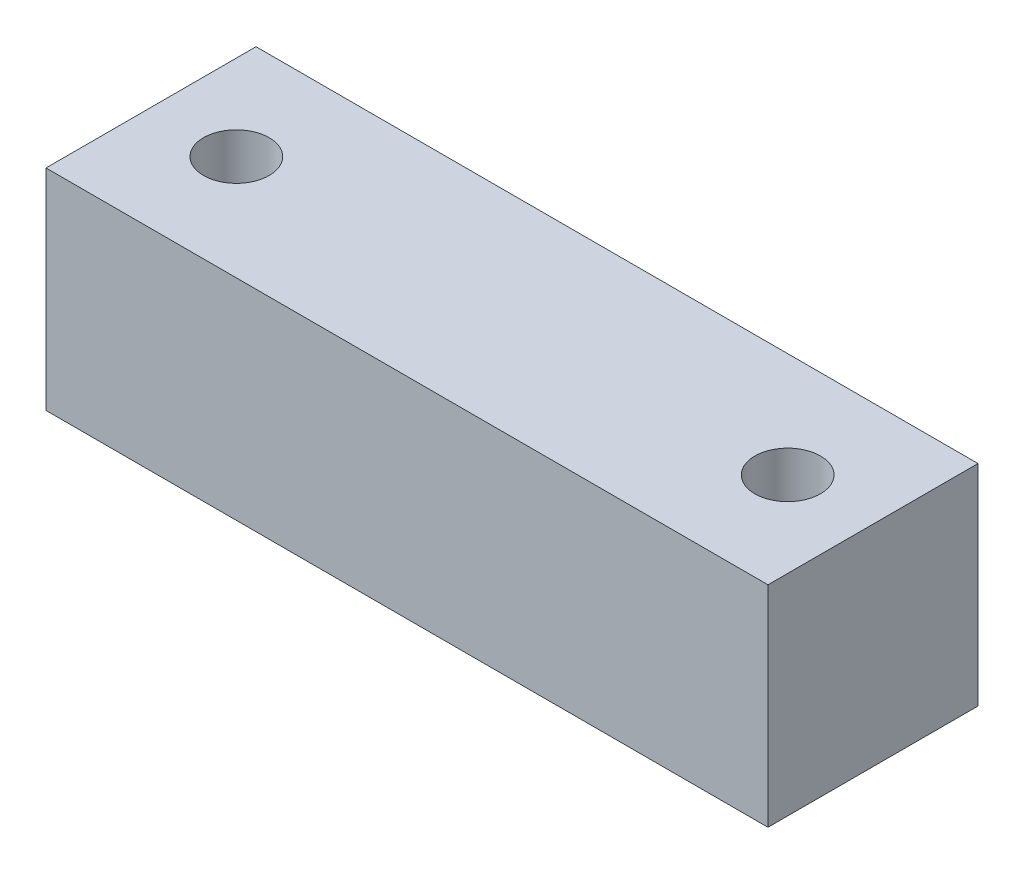
ISO-10303-21;
HEADER;
FILE_DESCRIPTION(('STEP AP214'),'2;1');
FILE_NAME('part.step','',(''),(''),'','','');
FILE_SCHEMA(('AUTOMOTIVE_DESIGN { 1 0 10303 214 1 1 1 1 }'));
ENDSEC;
DATA;
#1=APPLICATION_CONTEXT('core data for automotive mechanical design processes');
#2=APPLICATION_PROTOCOL_DEFINITION('international standard','automotive_design',2000,#1);
#3=PRODUCT_CONTEXT('',#1,'mechanical');
#4=PRODUCT('Part','Part','',(#3));
#5=PRODUCT_RELATED_PRODUCT_CATEGORY('part','',(#4));
#6=PRODUCT_DEFINITION_FORMATION('','',#4);
#7=PRODUCT_DEFINITION_CONTEXT('part definition',#1,'design');
#8=PRODUCT_DEFINITION('design','',#6,#7);
#9=PRODUCT_DEFINITION_SHAPE('','',#8);
#10=(LENGTH_UNIT() NAMED_UNIT(*) SI_UNIT(.MILLI.,.METRE.));
#11=(NAMED_UNIT(*) PLANE_ANGLE_UNIT() SI_UNIT($,.RADIAN.));
#12=(NAMED_UNIT(*) SI_UNIT($,.STERADIAN.) SOLID_ANGLE_UNIT());
#13=UNCERTAINTY_MEASURE_WITH_UNIT(LENGTH_MEASURE(1.E-05),#10,'distance_accuracy_value','');
#14=(GEOMETRIC_REPRESENTATION_CONTEXT(3) GLOBAL_UNCERTAINTY_ASSIGNED_CONTEXT((#13)) GLOBAL_UNIT_ASSIGNED_CONTEXT((#10,
#11,#12)) REPRESENTATION_CONTEXT('',''));
#15=CARTESIAN_POINT('',(0.,0.,0.));
#16=DIRECTION('',(0.,0.,1.));
#17=DIRECTION('',(1.,0.,0.));
#18=AXIS2_PLACEMENT_3D('',#15,#16,#17);
#19=CARTESIAN_POINT('',(0.,16.,0.));
#20=DIRECTION('',(1.,0.,0.));
#21=DIRECTION('',(0.,0.,-1.));
#22=AXIS2_PLACEMENT_3D('',#19,#20,#21);
#23=PLANE('',#22);
#24=DIRECTION('',(0.,0.,1.));
#25=VECTOR('',#24,1.);
#26=CARTESIAN_POINT('',(0.,0.,0.));
#27=LINE('',#26,#25);
#28=CARTESIAN_POINT('',(0.,0.,-12.));
#29=VERTEX_POINT('',#28);
#30=CARTESIAN_POINT('',(0.,0.,4.));
#31=VERTEX_POINT('',#30);
#32=EDGE_CURVE('E78',#29,#31,#27,.T.);
#33=ORIENTED_EDGE('',*,*,#32,.T.);
#34=DIRECTION('',(0.,-1.,0.));
#35=VECTOR('',#34,1.);
#36=CARTESIAN_POINT('',(0.,16.,4.));
#37=LINE('',#36,#35);
#38=CARTESIAN_POINT('',(0.,16.,4.));
#39=VERTEX_POINT('',#38);
#40=EDGE_CURVE('E94',#39,#31,#37,.T.);
#41=ORIENTED_EDGE('',*,*,#40,.F.);
#42=DIRECTION('',(0.,0.,1.));
#43=VECTOR('',#42,1.);
#44=CARTESIAN_POINT('',(0.,16.,0.));
#45=LINE('',#44,#43);
#46=CARTESIAN_POINT('',(0.,16.,-12.));
#47=VERTEX_POINT('',#46);
#48=EDGE_CURVE('E40',#47,#39,#45,.T.);
#49=ORIENTED_EDGE('',*,*,#48,.F.);
#50=DIRECTION('',(0.,1.,0.));
#51=VECTOR('',#50,1.);
#52=CARTESIAN_POINT('',(0.,0.,-12.));
#53=LINE('',#52,#51);
#54=EDGE_CURVE('E85',#29,#47,#53,.T.);
#55=ORIENTED_EDGE('',*,*,#54,.F.);
#56=EDGE_LOOP('',(#33,#41,#49,#55));
#57=FACE_BOUND('',#56,.T.);
#58=ADVANCED_FACE('F32',(#57),#23,.F.);
#59=CARTESIAN_POINT('',(55.,16.,0.));
#60=DIRECTION('',(-1.,0.,0.));
#61=DIRECTION('',(0.,0.,1.));
#62=AXIS2_PLACEMENT_3D('',#59,#60,#61);
#63=PLANE('',#62);
#64=DIRECTION('',(0.,0.,-1.));
#65=VECTOR('',#64,1.);
#66=CARTESIAN_POINT('',(55.,0.,0.));
#67=LINE('',#66,#65);
#68=CARTESIAN_POINT('',(55.,0.,4.));
#69=VERTEX_POINT('',#68);
#70=CARTESIAN_POINT('',(55.,0.,-12.));
#71=VERTEX_POINT('',#70);
#72=EDGE_CURVE('E35',#69,#71,#67,.T.);
#73=ORIENTED_EDGE('',*,*,#72,.T.);
#74=DIRECTION('',(0.,-1.,0.));
#75=VECTOR('',#74,1.);
#76=CARTESIAN_POINT('',(55.,0.,-12.));
#77=LINE('',#76,#75);
#78=CARTESIAN_POINT('',(55.,16.,-12.));
#79=VERTEX_POINT('',#78);
#80=EDGE_CURVE('E73',#79,#71,#77,.T.);
#81=ORIENTED_EDGE('',*,*,#80,.F.);
#82=DIRECTION('',(0.,0.,-1.));
#83=VECTOR('',#82,1.);
#84=CARTESIAN_POINT('',(55.,16.,0.));
#85=LINE('',#84,#83);
#86=CARTESIAN_POINT('',(55.,16.,4.));
#87=VERTEX_POINT('',#86);
#88=EDGE_CURVE('E11',#87,#79,#85,.T.);
#89=ORIENTED_EDGE('',*,*,#88,.F.);
#90=DIRECTION('',(0.,1.,0.));
#91=VECTOR('',#90,1.);
#92=CARTESIAN_POINT('',(55.,16.,4.));
#93=LINE('',#92,#91);
#94=EDGE_CURVE('E74',#69,#87,#93,.T.);
#95=ORIENTED_EDGE('',*,*,#94,.F.);
#96=EDGE_LOOP('',(#73,#81,#89,#95));
#97=FACE_BOUND('',#96,.T.);
#98=ADVANCED_FACE('F71',(#97),#63,.F.);
#99=CARTESIAN_POINT('',(0.,16.,0.));
#100=DIRECTION('',(0.,-1.,0.));
#101=DIRECTION('',(0.,0.,-1.));
#102=AXIS2_PLACEMENT_3D('',#99,#100,#101);
#103=PLANE('',#102);
#104=CARTESIAN_POINT('',(48.5,16.,-4.));
#105=DIRECTION('',(0.,1.,0.));
#106=DIRECTION('',(0.,0.,1.));
#107=AXIS2_PLACEMENT_3D('',#104,#105,#106);
#108=CIRCLE('',#107,2.5);
#109=CARTESIAN_POINT('',(48.5,16.,-1.5));
#110=VERTEX_POINT('',#109);
#111=EDGE_CURVE('E102',#110,#110,#108,.T.);
#112=ORIENTED_EDGE('',*,*,#111,.F.);
#113=EDGE_LOOP('',(#112));
#114=FACE_BOUND('',#113,.T.);
#115=CARTESIAN_POINT('',(6.5,16.,-4.));
#116=DIRECTION('',(0.,1.,0.));
#117=DIRECTION('',(0.,0.,1.));
#118=AXIS2_PLACEMENT_3D('',#115,#116,#117);
#119=CIRCLE('',#118,2.5);
#120=CARTESIAN_POINT('',(6.5,16.,-1.5));
#121=VERTEX_POINT('',#120);
#122=EDGE_CURVE('E106',#121,#121,#119,.T.);
#123=ORIENTED_EDGE('',*,*,#122,.F.);
#124=EDGE_LOOP('',(#123));
#125=FACE_BOUND('',#124,.T.);
#126=ORIENTED_EDGE('',*,*,#48,.T.);
#127=DIRECTION('',(-1.,0.,0.));
#128=VECTOR('',#127,1.);
#129=CARTESIAN_POINT('',(0.,16.,4.));
#130=LINE('',#129,#128);
#131=EDGE_CURVE('E100',#87,#39,#130,.T.);
#132=ORIENTED_EDGE('',*,*,#131,.F.);
#133=ORIENTED_EDGE('',*,*,#88,.T.);
#134=DIRECTION('',(1.,0.,0.));
#135=VECTOR('',#134,1.);
#136=CARTESIAN_POINT('',(55.,16.,-12.));
#137=LINE('',#136,#135);
#138=EDGE_CURVE('E89',#47,#79,#137,.T.);
#139=ORIENTED_EDGE('',*,*,#138,.F.);
#140=EDGE_LOOP('',(#126,#132,#133,#139));
#141=FACE_BOUND('',#140,.T.);
#142=ADVANCED_FACE('F118',(#114,#125,#141),#103,.F.);
#143=CARTESIAN_POINT('',(0.,0.,0.));
#144=DIRECTION('',(0.,-1.,0.));
#145=DIRECTION('',(0.,0.,-1.));
#146=AXIS2_PLACEMENT_3D('',#143,#144,#145);
#147=PLANE('',#146);
#148=CARTESIAN_POINT('',(48.5,0.,-4.));
#149=DIRECTION('',(0.,1.,0.));
#150=DIRECTION('',(0.,0.,1.));
#151=AXIS2_PLACEMENT_3D('',#148,#149,#150);
#152=CIRCLE('',#151,2.5);
#153=CARTESIAN_POINT('',(48.5,0.,-1.5));
#154=VERTEX_POINT('',#153);
#155=EDGE_CURVE('E103',#154,#154,#152,.T.);
#156=ORIENTED_EDGE('',*,*,#155,.T.);
#157=EDGE_LOOP('',(#156));
#158=FACE_BOUND('',#157,.T.);
#159=CARTESIAN_POINT('',(6.5,0.,-4.));
#160=DIRECTION('',(0.,1.,0.));
#161=DIRECTION('',(0.,0.,1.));
#162=AXIS2_PLACEMENT_3D('',#159,#160,#161);
#163=CIRCLE('',#162,2.5);
#164=CARTESIAN_POINT('',(6.5,0.,-1.5));
#165=VERTEX_POINT('',#164);
#166=EDGE_CURVE('E109',#165,#165,#163,.T.);
#167=ORIENTED_EDGE('',*,*,#166,.T.);
#168=EDGE_LOOP('',(#167));
#169=FACE_BOUND('',#168,.T.);
#170=ORIENTED_EDGE('',*,*,#32,.F.);
#171=DIRECTION('',(-1.,0.,0.));
#172=VECTOR('',#171,1.);
#173=CARTESIAN_POINT('',(55.,0.,-12.));
#174=LINE('',#173,#172);
#175=EDGE_CURVE('E80',#71,#29,#174,.T.);
#176=ORIENTED_EDGE('',*,*,#175,.F.);
#177=ORIENTED_EDGE('',*,*,#72,.F.);
#178=DIRECTION('',(1.,0.,0.));
#179=VECTOR('',#178,1.);
#180=CARTESIAN_POINT('',(0.,0.,4.));
#181=LINE('',#180,#179);
#182=EDGE_CURVE('E97',#31,#69,#181,.T.);
#183=ORIENTED_EDGE('',*,*,#182,.F.);
#184=EDGE_LOOP('',(#170,#176,#177,#183));
#185=FACE_BOUND('',#184,.T.);
#186=ADVANCED_FACE('F81',(#158,#169,#185),#147,.T.);
#187=CARTESIAN_POINT('',(6.5,0.,-4.));
#188=DIRECTION('',(0.,1.,0.));
#189=DIRECTION('',(0.,0.,1.));
#190=AXIS2_PLACEMENT_3D('',#187,#188,#189);
#191=CYLINDRICAL_SURFACE('',#190,2.5);
#192=ORIENTED_EDGE('',*,*,#166,.F.);
#193=EDGE_LOOP('',(#192));
#194=FACE_BOUND('',#193,.T.);
#195=ORIENTED_EDGE('',*,*,#122,.T.);
#196=EDGE_LOOP('',(#195));
#197=FACE_BOUND('',#196,.T.);
#198=ADVANCED_FACE('F126',(#194,#197),#191,.F.);
#199=CARTESIAN_POINT('',(48.5,0.,-4.));
#200=DIRECTION('',(0.,1.,0.));
#201=DIRECTION('',(0.,0.,1.));
#202=AXIS2_PLACEMENT_3D('',#199,#200,#201);
#203=CYLINDRICAL_SURFACE('',#202,2.5);
#204=ORIENTED_EDGE('',*,*,#155,.F.);
#205=EDGE_LOOP('',(#204));
#206=FACE_BOUND('',#205,.T.);
#207=ORIENTED_EDGE('',*,*,#111,.T.);
#208=EDGE_LOOP('',(#207));
#209=FACE_BOUND('',#208,.T.);
#210=ADVANCED_FACE('F169',(#206,#209),#203,.F.);
#211=CARTESIAN_POINT('',(0.,0.,4.));
#212=DIRECTION('',(0.,0.,1.));
#213=DIRECTION('',(1.,0.,0.));
#214=AXIS2_PLACEMENT_3D('',#211,#212,#213);
#215=PLANE('',#214);
#216=ORIENTED_EDGE('',*,*,#40,.T.);
#217=ORIENTED_EDGE('',*,*,#182,.T.);
#218=ORIENTED_EDGE('',*,*,#94,.T.);
#219=ORIENTED_EDGE('',*,*,#131,.T.);
#220=EDGE_LOOP('',(#216,#217,#218,#219));
#221=FACE_BOUND('',#220,.T.);
#222=ADVANCED_FACE('F117',(#221),#215,.T.);
#223=CARTESIAN_POINT('',(0.,0.,-12.));
#224=DIRECTION('',(0.,0.,1.));
#225=DIRECTION('',(1.,0.,0.));
#226=AXIS2_PLACEMENT_3D('',#223,#224,#225);
#227=PLANE('',#226);
#228=ORIENTED_EDGE('',*,*,#80,.T.);
#229=ORIENTED_EDGE('',*,*,#175,.T.);
#230=ORIENTED_EDGE('',*,*,#54,.T.);
#231=ORIENTED_EDGE('',*,*,#138,.T.);
#232=EDGE_LOOP('',(#228,#229,#230,#231));
#233=FACE_BOUND('',#232,.T.);
#234=ADVANCED_FACE('F88',(#233),#227,.F.);
#235=CLOSED_SHELL('',(#58,#98,#142,#186,#198,#210,#222,#234));
#236=MANIFOLD_SOLID_BREP('B2',#235);
#237=ADVANCED_BREP_SHAPE_REPRESENTATION('',(#18,#236),#14);
#238=SHAPE_DEFINITION_REPRESENTATION(#9,#237);
ENDSEC;
END-ISO-10303-21;
